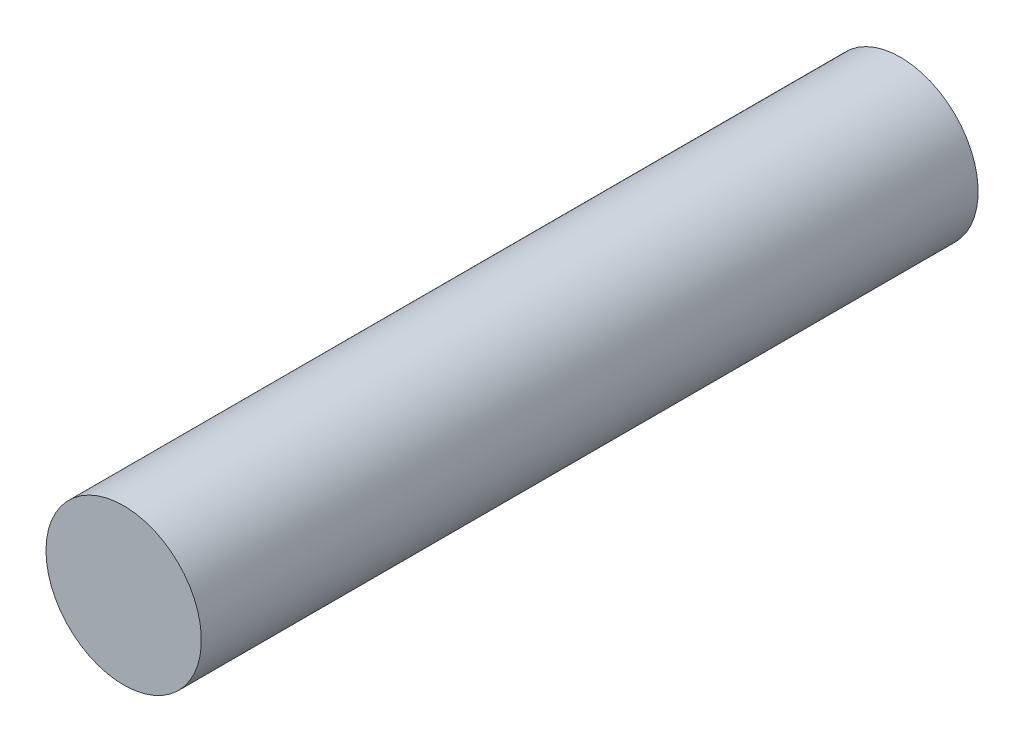
ISO-10303-21;
HEADER;
FILE_DESCRIPTION(('STEP AP214'),'2;1');
FILE_NAME('part.step','',(''),(''),'','','');
FILE_SCHEMA(('AUTOMOTIVE_DESIGN { 1 0 10303 214 1 1 1 1 }'));
ENDSEC;
DATA;
#1=APPLICATION_CONTEXT('core data for automotive mechanical design processes');
#2=APPLICATION_PROTOCOL_DEFINITION('international standard','automotive_design',2000,#1);
#3=PRODUCT_CONTEXT('',#1,'mechanical');
#4=PRODUCT('Part','Part','',(#3));
#5=PRODUCT_RELATED_PRODUCT_CATEGORY('part','',(#4));
#6=PRODUCT_DEFINITION_FORMATION('','',#4);
#7=PRODUCT_DEFINITION_CONTEXT('part definition',#1,'design');
#8=PRODUCT_DEFINITION('design','',#6,#7);
#9=PRODUCT_DEFINITION_SHAPE('','',#8);
#10=(LENGTH_UNIT() NAMED_UNIT(*) SI_UNIT(.MILLI.,.METRE.));
#11=(NAMED_UNIT(*) PLANE_ANGLE_UNIT() SI_UNIT($,.RADIAN.));
#12=(NAMED_UNIT(*) SI_UNIT($,.STERADIAN.) SOLID_ANGLE_UNIT());
#13=UNCERTAINTY_MEASURE_WITH_UNIT(LENGTH_MEASURE(1.E-05),#10,'distance_accuracy_value','');
#14=(GEOMETRIC_REPRESENTATION_CONTEXT(3) GLOBAL_UNCERTAINTY_ASSIGNED_CONTEXT((#13)) GLOBAL_UNIT_ASSIGNED_CONTEXT((#10,
#11,#12)) REPRESENTATION_CONTEXT('',''));
#15=CARTESIAN_POINT('',(0.,0.,0.));
#16=DIRECTION('',(0.,0.,1.));
#17=DIRECTION('',(1.,0.,0.));
#18=AXIS2_PLACEMENT_3D('',#15,#16,#17);
#19=CARTESIAN_POINT('',(0.,0.,79.375));
#20=DIRECTION('',(0.,0.,-1.));
#21=DIRECTION('',(-1.,0.,0.));
#22=AXIS2_PLACEMENT_3D('',#19,#20,#21);
#23=CYLINDRICAL_SURFACE('',#22,7.9375);
#24=CARTESIAN_POINT('',(0.,0.,79.375));
#25=DIRECTION('',(0.,0.,1.));
#26=DIRECTION('',(1.,0.,0.));
#27=AXIS2_PLACEMENT_3D('',#24,#25,#26);
#28=CIRCLE('',#27,7.9375);
#29=CARTESIAN_POINT('',(-7.9375,0.,79.375));
#30=VERTEX_POINT('',#29);
#31=EDGE_CURVE('E10',#30,#30,#28,.T.);
#32=CARTESIAN_POINT('',(0.,0.,0.));
#33=DIRECTION('',(0.,0.,1.));
#34=DIRECTION('',(1.,0.,0.));
#35=AXIS2_PLACEMENT_3D('',#32,#33,#34);
#36=CIRCLE('',#35,7.9375);
#37=CARTESIAN_POINT('',(-7.9375,0.,0.));
#38=VERTEX_POINT('',#37);
#39=EDGE_CURVE('E34',#38,#38,#36,.T.);
#40=CARTESIAN_POINT('',(-7.9375,0.,79.375));
#41=CARTESIAN_POINT('',(-7.9375,0.,78.5481770833333));
#42=CARTESIAN_POINT('',(-7.9375,0.,77.7213541666667));
#43=CARTESIAN_POINT('',(-7.9375,0.,76.0677083333333));
#44=CARTESIAN_POINT('',(-7.9375,0.,75.2408854166667));
#45=CARTESIAN_POINT('',(-7.9375,0.,73.5872395833333));
#46=CARTESIAN_POINT('',(-7.9375,0.,72.7604166666667));
#47=CARTESIAN_POINT('',(-7.9375,0.,71.1067708333333));
#48=CARTESIAN_POINT('',(-7.9375,0.,70.2799479166667));
#49=CARTESIAN_POINT('',(-7.9375,0.,68.6263020833333));
#50=CARTESIAN_POINT('',(-7.9375,0.,67.7994791666667));
#51=CARTESIAN_POINT('',(-7.9375,0.,66.1458333333333));
#52=CARTESIAN_POINT('',(-7.9375,0.,65.3190104166667));
#53=CARTESIAN_POINT('',(-7.9375,0.,63.6653645833333));
#54=CARTESIAN_POINT('',(-7.9375,0.,62.8385416666667));
#55=CARTESIAN_POINT('',(-7.9375,0.,61.1848958333333));
#56=CARTESIAN_POINT('',(-7.9375,0.,60.3580729166667));
#57=CARTESIAN_POINT('',(-7.9375,0.,58.7044270833333));
#58=CARTESIAN_POINT('',(-7.9375,0.,57.8776041666667));
#59=CARTESIAN_POINT('',(-7.9375,0.,56.2239583333333));
#60=CARTESIAN_POINT('',(-7.9375,0.,55.3971354166667));
#61=CARTESIAN_POINT('',(-7.9375,0.,53.7434895833333));
#62=CARTESIAN_POINT('',(-7.9375,0.,52.9166666666667));
#63=CARTESIAN_POINT('',(-7.9375,0.,51.2630208333333));
#64=CARTESIAN_POINT('',(-7.9375,0.,50.4361979166667));
#65=CARTESIAN_POINT('',(-7.9375,0.,48.7825520833333));
#66=CARTESIAN_POINT('',(-7.9375,0.,47.9557291666667));
#67=CARTESIAN_POINT('',(-7.9375,0.,46.3020833333333));
#68=CARTESIAN_POINT('',(-7.9375,0.,45.4752604166667));
#69=CARTESIAN_POINT('',(-7.9375,0.,43.8216145833333));
#70=CARTESIAN_POINT('',(-7.9375,0.,42.9947916666667));
#71=CARTESIAN_POINT('',(-7.9375,0.,41.3411458333333));
#72=CARTESIAN_POINT('',(-7.9375,0.,40.5143229166667));
#73=CARTESIAN_POINT('',(-7.9375,0.,38.8606770833333));
#74=CARTESIAN_POINT('',(-7.9375,0.,38.0338541666667));
#75=CARTESIAN_POINT('',(-7.9375,0.,36.3802083333333));
#76=CARTESIAN_POINT('',(-7.9375,0.,35.5533854166667));
#77=CARTESIAN_POINT('',(-7.9375,0.,33.8997395833333));
#78=CARTESIAN_POINT('',(-7.9375,0.,33.0729166666667));
#79=CARTESIAN_POINT('',(-7.9375,0.,31.4192708333333));
#80=CARTESIAN_POINT('',(-7.9375,0.,30.5924479166667));
#81=CARTESIAN_POINT('',(-7.9375,0.,28.9388020833333));
#82=CARTESIAN_POINT('',(-7.9375,0.,28.1119791666667));
#83=CARTESIAN_POINT('',(-7.9375,0.,26.4583333333333));
#84=CARTESIAN_POINT('',(-7.9375,0.,25.6315104166667));
#85=CARTESIAN_POINT('',(-7.9375,0.,23.9778645833333));
#86=CARTESIAN_POINT('',(-7.9375,0.,23.1510416666667));
#87=CARTESIAN_POINT('',(-7.9375,0.,21.4973958333333));
#88=CARTESIAN_POINT('',(-7.9375,0.,20.6705729166667));
#89=CARTESIAN_POINT('',(-7.9375,0.,19.0169270833333));
#90=CARTESIAN_POINT('',(-7.9375,0.,18.1901041666667));
#91=CARTESIAN_POINT('',(-7.9375,0.,16.5364583333333));
#92=CARTESIAN_POINT('',(-7.9375,0.,15.7096354166667));
#93=CARTESIAN_POINT('',(-7.9375,0.,14.0559895833333));
#94=CARTESIAN_POINT('',(-7.9375,0.,13.2291666666667));
#95=CARTESIAN_POINT('',(-7.9375,0.,11.5755208333333));
#96=CARTESIAN_POINT('',(-7.9375,0.,10.7486979166667));
#97=CARTESIAN_POINT('',(-7.9375,0.,9.09505208333332));
#98=CARTESIAN_POINT('',(-7.9375,0.,8.26822916666666));
#99=CARTESIAN_POINT('',(-7.9375,0.,6.61458333333332));
#100=CARTESIAN_POINT('',(-7.9375,0.,5.78776041666665));
#101=CARTESIAN_POINT('',(-7.9375,0.,4.13411458333332));
#102=CARTESIAN_POINT('',(-7.9375,0.,3.30729166666666));
#103=CARTESIAN_POINT('',(-7.9375,0.,1.65364583333332));
#104=CARTESIAN_POINT('',(-7.9375,0.,0.826822916666655));
#105=CARTESIAN_POINT('',(-7.9375,0.,0.));
#106=B_SPLINE_CURVE_WITH_KNOTS('',3,(#40,#41,#42,#43,#44,#45,#46,#47,#48,#49,#50,#51,#52,#53,
#54,#55,#56,#57,#58,#59,#60,#61,#62,#63,#64,#65,#66,#67,#68,#69,#70,#71,#72,#73,#74,#75,#76,#77,
#78,#79,#80,#81,#82,#83,#84,#85,#86,#87,#88,#89,#90,#91,#92,#93,#94,#95,#96,#97,#98,#99,#100,
#101,#102,#103,#104,#105),.UNSPECIFIED.,.F.,.F.,(4,2,2,2,2,2,2,2,2,2,2,2,2,2,2,2,2,2,2,2,2,2,2,
2,2,2,2,2,2,2,2,2,4),(0.,2.48046874999999,4.9609375,7.44140624999999,9.921875,12.40234375,
14.8828125,17.36328125,19.84375,22.32421875,24.8046875,27.28515625,29.765625,32.24609375,
34.7265625,37.20703125,39.6875,42.16796875,44.6484375,47.12890625,49.609375,52.08984375,
54.5703125,57.05078125,59.53125,62.01171875,64.4921875,66.97265625,69.453125,71.93359375,
74.4140625,76.89453125,79.375),.UNSPECIFIED.);
#107=EDGE_CURVE('BSEAM31',#30,#38,#106,.T.);
#108=ORIENTED_EDGE('',*,*,#31,.F.);
#109=ORIENTED_EDGE('',*,*,#39,.T.);
#110=ORIENTED_EDGE('',*,*,#107,.T.);
#111=ORIENTED_EDGE('',*,*,#107,.F.);
#112=EDGE_LOOP('',(#108,#110,#109,#111));
#113=FACE_BOUND('',#112,.T.);
#114=ADVANCED_FACE('F31',(#113),#23,.T.);
#115=CARTESIAN_POINT('',(0.,0.,79.375));
#116=DIRECTION('',(0.,0.,1.));
#117=DIRECTION('',(1.,0.,0.));
#118=AXIS2_PLACEMENT_3D('',#115,#116,#117);
#119=PLANE('',#118);
#120=ORIENTED_EDGE('',*,*,#31,.T.);
#121=EDGE_LOOP('',(#120));
#122=FACE_BOUND('',#121,.T.);
#123=ADVANCED_FACE('F46',(#122),#119,.T.);
#124=CARTESIAN_POINT('',(0.,0.,0.));
#125=DIRECTION('',(0.,0.,1.));
#126=DIRECTION('',(1.,0.,0.));
#127=AXIS2_PLACEMENT_3D('',#124,#125,#126);
#128=PLANE('',#127);
#129=ORIENTED_EDGE('',*,*,#39,.F.);
#130=EDGE_LOOP('',(#129));
#131=FACE_BOUND('',#130,.T.);
#132=ADVANCED_FACE('F44',(#131),#128,.F.);
#133=CLOSED_SHELL('',(#114,#123,#132));
#134=MANIFOLD_SOLID_BREP('B2',#133);
#135=ADVANCED_BREP_SHAPE_REPRESENTATION('',(#18,#134),#14);
#136=SHAPE_DEFINITION_REPRESENTATION(#9,#135);
ENDSEC;
END-ISO-10303-21;
